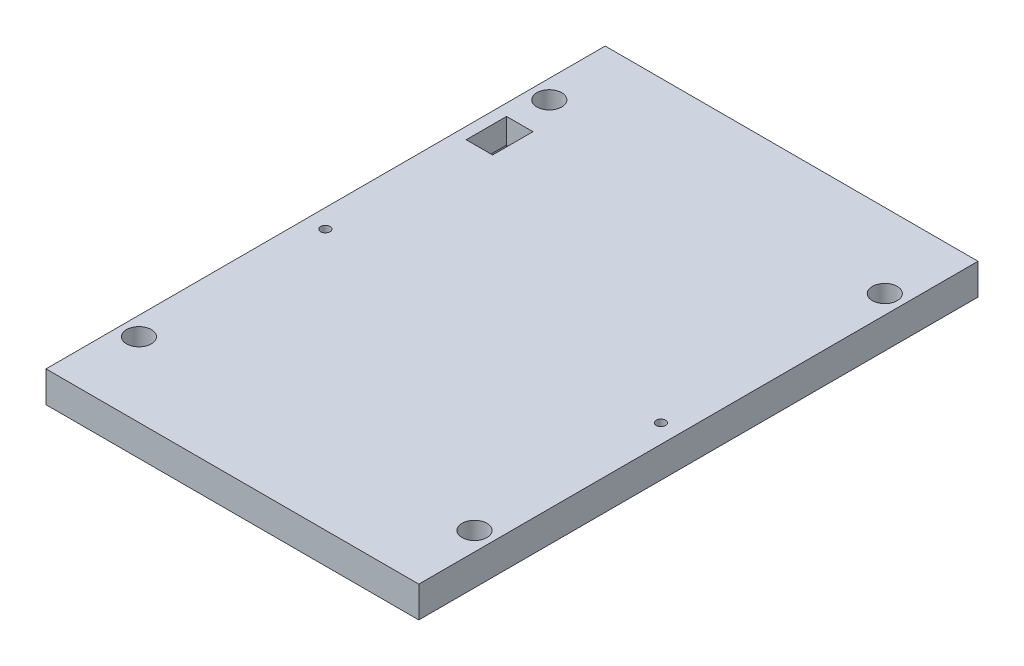
ISO-10303-21;
HEADER;
FILE_DESCRIPTION(('STEP AP214'),'2;1');
FILE_NAME('part.step','',(''),(''),'','','');
FILE_SCHEMA(('AUTOMOTIVE_DESIGN { 1 0 10303 214 1 1 1 1 }'));
ENDSEC;
DATA;
#1=APPLICATION_CONTEXT('core data for automotive mechanical design processes');
#2=APPLICATION_PROTOCOL_DEFINITION('international standard','automotive_design',2000,#1);
#3=PRODUCT_CONTEXT('',#1,'mechanical');
#4=PRODUCT('Part','Part','',(#3));
#5=PRODUCT_RELATED_PRODUCT_CATEGORY('part','',(#4));
#6=PRODUCT_DEFINITION_FORMATION('','',#4);
#7=PRODUCT_DEFINITION_CONTEXT('part definition',#1,'design');
#8=PRODUCT_DEFINITION('design','',#6,#7);
#9=PRODUCT_DEFINITION_SHAPE('','',#8);
#10=(LENGTH_UNIT() NAMED_UNIT(*) SI_UNIT(.MILLI.,.METRE.));
#11=(NAMED_UNIT(*) PLANE_ANGLE_UNIT() SI_UNIT($,.RADIAN.));
#12=(NAMED_UNIT(*) SI_UNIT($,.STERADIAN.) SOLID_ANGLE_UNIT());
#13=UNCERTAINTY_MEASURE_WITH_UNIT(LENGTH_MEASURE(1.E-05),#10,'distance_accuracy_value','');
#14=(GEOMETRIC_REPRESENTATION_CONTEXT(3) GLOBAL_UNCERTAINTY_ASSIGNED_CONTEXT((#13)) GLOBAL_UNIT_ASSIGNED_CONTEXT((#10,
#11,#12)) REPRESENTATION_CONTEXT('',''));
#15=CARTESIAN_POINT('',(0.,0.,0.));
#16=DIRECTION('',(0.,0.,1.));
#17=DIRECTION('',(1.,0.,0.));
#18=AXIS2_PLACEMENT_3D('',#15,#16,#17);
#19=CARTESIAN_POINT('',(-79.5725168398676,10.,74.5725168424847));
#20=DIRECTION('',(1.,0.,0.));
#21=DIRECTION('',(0.,0.,-1.));
#22=AXIS2_PLACEMENT_3D('',#19,#20,#21);
#23=PLANE('',#22);
#24=DIRECTION('',(0.,0.,1.));
#25=VECTOR('',#24,1.);
#26=CARTESIAN_POINT('',(-79.5725168398676,0.,74.5725168424847));
#27=LINE('',#26,#25);
#28=CARTESIAN_POINT('',(-79.5725168398676,0.,-105.427483157515));
#29=VERTEX_POINT('',#28);
#30=CARTESIAN_POINT('',(-79.5725168398676,0.,74.5725168424847));
#31=VERTEX_POINT('',#30);
#32=EDGE_CURVE('E326',#29,#31,#27,.T.);
#33=ORIENTED_EDGE('',*,*,#32,.T.);
#34=DIRECTION('',(0.,-1.,0.));
#35=VECTOR('',#34,1.);
#36=CARTESIAN_POINT('',(-79.5725168398676,10.,74.5725168424847));
#37=LINE('',#36,#35);
#38=CARTESIAN_POINT('',(-79.5725168398676,10.,74.5725168424847));
#39=VERTEX_POINT('',#38);
#40=EDGE_CURVE('E355',#39,#31,#37,.T.);
#41=ORIENTED_EDGE('',*,*,#40,.F.);
#42=DIRECTION('',(0.,0.,1.));
#43=VECTOR('',#42,1.);
#44=CARTESIAN_POINT('',(-79.5725168398676,10.,74.5725168424847));
#45=LINE('',#44,#43);
#46=CARTESIAN_POINT('',(-79.5725168398676,10.,-105.427483157515));
#47=VERTEX_POINT('',#46);
#48=EDGE_CURVE('E329',#47,#39,#45,.T.);
#49=ORIENTED_EDGE('',*,*,#48,.F.);
#50=DIRECTION('',(0.,-1.,0.));
#51=VECTOR('',#50,1.);
#52=CARTESIAN_POINT('',(-79.5725168398676,10.,-105.427483157515));
#53=LINE('',#52,#51);
#54=EDGE_CURVE('E339',#47,#29,#53,.T.);
#55=ORIENTED_EDGE('',*,*,#54,.T.);
#56=EDGE_LOOP('',(#33,#41,#49,#55));
#57=FACE_BOUND('',#56,.T.);
#58=ADVANCED_FACE('F33',(#57),#23,.F.);
#59=CARTESIAN_POINT('',(40.4274831601324,10.,74.5725168424847));
#60=DIRECTION('',(0.,0.,-1.));
#61=DIRECTION('',(-1.,0.,0.));
#62=AXIS2_PLACEMENT_3D('',#59,#60,#61);
#63=PLANE('',#62);
#64=DIRECTION('',(1.,0.,0.));
#65=VECTOR('',#64,1.);
#66=CARTESIAN_POINT('',(40.4274831601324,0.,74.5725168424847));
#67=LINE('',#66,#65);
#68=CARTESIAN_POINT('',(40.4274831601324,0.,74.5725168424847));
#69=VERTEX_POINT('',#68);
#70=EDGE_CURVE('E342',#31,#69,#67,.T.);
#71=ORIENTED_EDGE('',*,*,#70,.T.);
#72=DIRECTION('',(0.,-1.,0.));
#73=VECTOR('',#72,1.);
#74=CARTESIAN_POINT('',(40.4274831601324,10.,74.5725168424847));
#75=LINE('',#74,#73);
#76=CARTESIAN_POINT('',(40.4274831601324,10.,74.5725168424847));
#77=VERTEX_POINT('',#76);
#78=EDGE_CURVE('E352',#77,#69,#75,.T.);
#79=ORIENTED_EDGE('',*,*,#78,.F.);
#80=DIRECTION('',(1.,0.,0.));
#81=VECTOR('',#80,1.);
#82=CARTESIAN_POINT('',(40.4274831601324,10.,74.5725168424847));
#83=LINE('',#82,#81);
#84=EDGE_CURVE('E332',#39,#77,#83,.T.);
#85=ORIENTED_EDGE('',*,*,#84,.F.);
#86=ORIENTED_EDGE('',*,*,#40,.T.);
#87=EDGE_LOOP('',(#71,#79,#85,#86));
#88=FACE_BOUND('',#87,.T.);
#89=ADVANCED_FACE('F378',(#88),#63,.F.);
#90=CARTESIAN_POINT('',(40.4274831601324,10.,74.5725168424847));
#91=DIRECTION('',(-1.,0.,0.));
#92=DIRECTION('',(0.,0.,1.));
#93=AXIS2_PLACEMENT_3D('',#90,#91,#92);
#94=PLANE('',#93);
#95=DIRECTION('',(0.,0.,-1.));
#96=VECTOR('',#95,1.);
#97=CARTESIAN_POINT('',(40.4274831601324,0.,74.5725168424847));
#98=LINE('',#97,#96);
#99=CARTESIAN_POINT('',(40.4274831601324,0.,-105.427483157515));
#100=VERTEX_POINT('',#99);
#101=EDGE_CURVE('E344',#69,#100,#98,.T.);
#102=ORIENTED_EDGE('',*,*,#101,.T.);
#103=DIRECTION('',(0.,-1.,0.));
#104=VECTOR('',#103,1.);
#105=CARTESIAN_POINT('',(40.4274831601324,10.,-105.427483157515));
#106=LINE('',#105,#104);
#107=CARTESIAN_POINT('',(40.4274831601324,10.,-105.427483157515));
#108=VERTEX_POINT('',#107);
#109=EDGE_CURVE('E349',#108,#100,#106,.T.);
#110=ORIENTED_EDGE('',*,*,#109,.F.);
#111=DIRECTION('',(0.,0.,-1.));
#112=VECTOR('',#111,1.);
#113=CARTESIAN_POINT('',(40.4274831601324,10.,74.5725168424847));
#114=LINE('',#113,#112);
#115=EDGE_CURVE('E335',#77,#108,#114,.T.);
#116=ORIENTED_EDGE('',*,*,#115,.F.);
#117=ORIENTED_EDGE('',*,*,#78,.T.);
#118=EDGE_LOOP('',(#102,#110,#116,#117));
#119=FACE_BOUND('',#118,.T.);
#120=ADVANCED_FACE('F383',(#119),#94,.F.);
#121=CARTESIAN_POINT('',(40.4274831601324,10.,-105.427483157515));
#122=DIRECTION('',(0.,0.,1.));
#123=DIRECTION('',(1.,0.,0.));
#124=AXIS2_PLACEMENT_3D('',#121,#122,#123);
#125=PLANE('',#124);
#126=DIRECTION('',(-1.,0.,0.));
#127=VECTOR('',#126,1.);
#128=CARTESIAN_POINT('',(40.4274831601324,0.,-105.427483157515));
#129=LINE('',#128,#127);
#130=EDGE_CURVE('E333',#100,#29,#129,.T.);
#131=ORIENTED_EDGE('',*,*,#130,.T.);
#132=ORIENTED_EDGE('',*,*,#54,.F.);
#133=DIRECTION('',(-1.,0.,0.));
#134=VECTOR('',#133,1.);
#135=CARTESIAN_POINT('',(40.4274831601324,10.,-105.427483157515));
#136=LINE('',#135,#134);
#137=EDGE_CURVE('E337',#108,#47,#136,.T.);
#138=ORIENTED_EDGE('',*,*,#137,.F.);
#139=ORIENTED_EDGE('',*,*,#109,.T.);
#140=EDGE_LOOP('',(#131,#132,#138,#139));
#141=FACE_BOUND('',#140,.T.);
#142=ADVANCED_FACE('F399',(#141),#125,.F.);
#143=CARTESIAN_POINT('',(0.,10.,0.));
#144=DIRECTION('',(0.,1.,0.));
#145=DIRECTION('',(0.,0.,1.));
#146=AXIS2_PLACEMENT_3D('',#143,#144,#145);
#147=PLANE('',#146);
#148=DIRECTION('',(0.,0.,-1.));
#149=VECTOR('',#148,1.);
#150=CARTESIAN_POINT('',(-75.8195072787271,10.,-69.9274831575152));
#151=LINE('',#150,#149);
#152=CARTESIAN_POINT('',(-75.8195072787271,10.,-56.9274831575152));
#153=VERTEX_POINT('',#152);
#154=CARTESIAN_POINT('',(-75.8195072787271,10.,-69.9274831575152));
#155=VERTEX_POINT('',#154);
#156=EDGE_CURVE('E171',#153,#155,#151,.T.);
#157=ORIENTED_EDGE('',*,*,#156,.T.);
#158=DIRECTION('',(1.,0.,0.));
#159=VECTOR('',#158,1.);
#160=CARTESIAN_POINT('',(-67.3195072787271,10.,-69.9274831575152));
#161=LINE('',#160,#159);
#162=CARTESIAN_POINT('',(-67.3195072787271,10.,-69.9274831575152));
#163=VERTEX_POINT('',#162);
#164=EDGE_CURVE('E179',#155,#163,#161,.T.);
#165=ORIENTED_EDGE('',*,*,#164,.T.);
#166=DIRECTION('',(0.,0.,1.));
#167=VECTOR('',#166,1.);
#168=CARTESIAN_POINT('',(-67.3195072787271,10.,-69.9274831575152));
#169=LINE('',#168,#167);
#170=CARTESIAN_POINT('',(-67.3195072787271,10.,-56.9274831575152));
#171=VERTEX_POINT('',#170);
#172=EDGE_CURVE('E47',#163,#171,#169,.T.);
#173=ORIENTED_EDGE('',*,*,#172,.T.);
#174=DIRECTION('',(-1.,0.,0.));
#175=VECTOR('',#174,1.);
#176=CARTESIAN_POINT('',(-67.3195072787271,10.,-56.9274831575152));
#177=LINE('',#176,#175);
#178=EDGE_CURVE('E176',#171,#153,#177,.T.);
#179=ORIENTED_EDGE('',*,*,#178,.T.);
#180=EDGE_LOOP('',(#157,#165,#173,#179));
#181=FACE_BOUND('',#180,.T.);
#182=CARTESIAN_POINT('',(-73.5725168398676,10.,50.6502092702943));
#183=DIRECTION('',(0.,-1.,0.));
#184=DIRECTION('',(0.,0.,-1.));
#185=AXIS2_PLACEMENT_3D('',#182,#183,#184);
#186=CIRCLE('',#185,3.99999999999999);
#187=CARTESIAN_POINT('',(-73.5725168398676,10.,46.6502092702943));
#188=VERTEX_POINT('',#187);
#189=EDGE_CURVE('E299',#188,#188,#186,.T.);
#190=ORIENTED_EDGE('',*,*,#189,.T.);
#191=EDGE_LOOP('',(#190));
#192=FACE_BOUND('',#191,.T.);
#193=CARTESIAN_POINT('',(34.4274831601325,10.,50.6502092702943));
#194=DIRECTION('',(0.,-1.,0.));
#195=DIRECTION('',(0.,0.,-1.));
#196=AXIS2_PLACEMENT_3D('',#193,#194,#195);
#197=CIRCLE('',#196,3.99999999999999);
#198=CARTESIAN_POINT('',(34.4274831601325,10.,46.6502092702943));
#199=VERTEX_POINT('',#198);
#200=EDGE_CURVE('E306',#199,#199,#197,.T.);
#201=ORIENTED_EDGE('',*,*,#200,.T.);
#202=EDGE_LOOP('',(#201));
#203=FACE_BOUND('',#202,.T.);
#204=CARTESIAN_POINT('',(34.4274831601325,10.,-9.34979072970571));
#205=DIRECTION('',(0.,-1.,0.));
#206=DIRECTION('',(0.,0.,-1.));
#207=AXIS2_PLACEMENT_3D('',#204,#205,#206);
#208=CIRCLE('',#207,1.5);
#209=CARTESIAN_POINT('',(34.4274831601325,10.,-10.8497907297057));
#210=VERTEX_POINT('',#209);
#211=EDGE_CURVE('E312',#210,#210,#208,.T.);
#212=ORIENTED_EDGE('',*,*,#211,.T.);
#213=EDGE_LOOP('',(#212));
#214=FACE_BOUND('',#213,.T.);
#215=CARTESIAN_POINT('',(34.4274831601325,10.,-81.4274831575153));
#216=DIRECTION('',(0.,-1.,0.));
#217=DIRECTION('',(0.,0.,-1.));
#218=AXIS2_PLACEMENT_3D('',#215,#216,#217);
#219=CIRCLE('',#218,3.99999999999999);
#220=CARTESIAN_POINT('',(34.4274831601325,10.,-85.4274831575153));
#221=VERTEX_POINT('',#220);
#222=EDGE_CURVE('E318',#221,#221,#219,.T.);
#223=ORIENTED_EDGE('',*,*,#222,.T.);
#224=EDGE_LOOP('',(#223));
#225=FACE_BOUND('',#224,.T.);
#226=CARTESIAN_POINT('',(-73.5725168398676,10.,-81.4274831575151));
#227=DIRECTION('',(0.,-1.,0.));
#228=DIRECTION('',(0.,0.,-1.));
#229=AXIS2_PLACEMENT_3D('',#226,#227,#228);
#230=CIRCLE('',#229,4.00000000000001);
#231=CARTESIAN_POINT('',(-73.5725168398676,10.,-85.4274831575151));
#232=VERTEX_POINT('',#231);
#233=EDGE_CURVE('E293',#232,#232,#230,.T.);
#234=ORIENTED_EDGE('',*,*,#233,.T.);
#235=EDGE_LOOP('',(#234));
#236=FACE_BOUND('',#235,.T.);
#237=CARTESIAN_POINT('',(-73.5725168398676,10.,-9.34979072970571));
#238=DIRECTION('',(0.,-1.,0.));
#239=DIRECTION('',(0.,0.,-1.));
#240=AXIS2_PLACEMENT_3D('',#237,#238,#239);
#241=CIRCLE('',#240,1.5);
#242=CARTESIAN_POINT('',(-73.5725168398676,10.,-10.8497907297057));
#243=VERTEX_POINT('',#242);
#244=EDGE_CURVE('E323',#243,#243,#241,.T.);
#245=ORIENTED_EDGE('',*,*,#244,.T.);
#246=EDGE_LOOP('',(#245));
#247=FACE_BOUND('',#246,.T.);
#248=ORIENTED_EDGE('',*,*,#48,.T.);
#249=ORIENTED_EDGE('',*,*,#84,.T.);
#250=ORIENTED_EDGE('',*,*,#115,.T.);
#251=ORIENTED_EDGE('',*,*,#137,.T.);
#252=EDGE_LOOP('',(#248,#249,#250,#251));
#253=FACE_BOUND('',#252,.T.);
#254=ADVANCED_FACE('F183',(#181,#192,#203,#214,#225,#236,#247,#253),#147,.T.);
#255=CARTESIAN_POINT('',(0.,0.,0.));
#256=DIRECTION('',(0.,1.,0.));
#257=DIRECTION('',(0.,0.,1.));
#258=AXIS2_PLACEMENT_3D('',#255,#256,#257);
#259=PLANE('',#258);
#260=DIRECTION('',(1.,0.,0.));
#261=VECTOR('',#260,1.);
#262=CARTESIAN_POINT('',(13.3217414866803,0.,18.0763742513696));
#263=LINE('',#262,#261);
#264=CARTESIAN_POINT('',(-53.6782585133198,0.,18.0763742513696));
#265=VERTEX_POINT('',#264);
#266=CARTESIAN_POINT('',(13.3217414866803,0.,18.0763742513696));
#267=VERTEX_POINT('',#266);
#268=EDGE_CURVE('E213',#265,#267,#263,.T.);
#269=ORIENTED_EDGE('',*,*,#268,.F.);
#270=DIRECTION('',(0.,0.,-1.));
#271=VECTOR('',#270,1.);
#272=CARTESIAN_POINT('',(-53.6782585133198,0.,18.0763742513696));
#273=LINE('',#272,#271);
#274=CARTESIAN_POINT('',(-53.6782585133198,0.,72.0763742513695));
#275=VERTEX_POINT('',#274);
#276=EDGE_CURVE('E211',#275,#265,#273,.T.);
#277=ORIENTED_EDGE('',*,*,#276,.F.);
#278=DIRECTION('',(-1.,0.,0.));
#279=VECTOR('',#278,1.);
#280=CARTESIAN_POINT('',(13.3217414866803,0.,72.0763742513696));
#281=LINE('',#280,#279);
#282=CARTESIAN_POINT('',(13.3217414866803,0.,72.0763742513696));
#283=VERTEX_POINT('',#282);
#284=EDGE_CURVE('E201',#283,#275,#281,.T.);
#285=ORIENTED_EDGE('',*,*,#284,.F.);
#286=DIRECTION('',(0.,0.,1.));
#287=VECTOR('',#286,1.);
#288=CARTESIAN_POINT('',(13.3217414866803,0.,18.0763742513696));
#289=LINE('',#288,#287);
#290=EDGE_CURVE('E217',#267,#283,#289,.T.);
#291=ORIENTED_EDGE('',*,*,#290,.F.);
#292=EDGE_LOOP('',(#269,#277,#285,#291));
#293=FACE_BOUND('',#292,.T.);
#294=DIRECTION('',(1.,0.,0.));
#295=VECTOR('',#294,1.);
#296=CARTESIAN_POINT('',(27.8739263182685,0.,-96.828520247566));
#297=LINE('',#296,#295);
#298=CARTESIAN_POINT('',(-57.1260736817315,0.,-96.828520247566));
#299=VERTEX_POINT('',#298);
#300=CARTESIAN_POINT('',(27.8739263182685,0.,-96.828520247566));
#301=VERTEX_POINT('',#300);
#302=EDGE_CURVE('E247',#299,#301,#297,.T.);
#303=ORIENTED_EDGE('',*,*,#302,.F.);
#304=DIRECTION('',(0.,0.,-1.));
#305=VECTOR('',#304,1.);
#306=CARTESIAN_POINT('',(-57.1260736817315,0.,-96.828520247566));
#307=LINE('',#306,#305);
#308=CARTESIAN_POINT('',(-57.1260736817315,0.,-55.8285202475661));
#309=VERTEX_POINT('',#308);
#310=EDGE_CURVE('E245',#309,#299,#307,.T.);
#311=ORIENTED_EDGE('',*,*,#310,.F.);
#312=DIRECTION('',(-1.,0.,0.));
#313=VECTOR('',#312,1.);
#314=CARTESIAN_POINT('',(27.8739263182685,0.,-55.828520247566));
#315=LINE('',#314,#313);
#316=CARTESIAN_POINT('',(27.8739263182685,0.,-55.828520247566));
#317=VERTEX_POINT('',#316);
#318=EDGE_CURVE('E235',#317,#309,#315,.T.);
#319=ORIENTED_EDGE('',*,*,#318,.F.);
#320=DIRECTION('',(0.,0.,1.));
#321=VECTOR('',#320,1.);
#322=CARTESIAN_POINT('',(27.8739263182685,0.,-96.828520247566));
#323=LINE('',#322,#321);
#324=EDGE_CURVE('E251',#301,#317,#323,.T.);
#325=ORIENTED_EDGE('',*,*,#324,.F.);
#326=EDGE_LOOP('',(#303,#311,#319,#325));
#327=FACE_BOUND('',#326,.T.);
#328=DIRECTION('',(-1.,0.,0.));
#329=VECTOR('',#328,1.);
#330=CARTESIAN_POINT('',(-76.7495072787272,0.,-56.0774831575152));
#331=LINE('',#330,#329);
#332=CARTESIAN_POINT('',(-66.3895072787272,0.,-56.0774831575152));
#333=VERTEX_POINT('',#332);
#334=CARTESIAN_POINT('',(-76.7495072787272,0.,-56.0774831575152));
#335=VERTEX_POINT('',#334);
#336=EDGE_CURVE('E278',#333,#335,#331,.T.);
#337=ORIENTED_EDGE('',*,*,#336,.F.);
#338=DIRECTION('',(0.,0.,1.));
#339=VECTOR('',#338,1.);
#340=CARTESIAN_POINT('',(-66.3895072787272,0.,-56.0774831575152));
#341=LINE('',#340,#339);
#342=CARTESIAN_POINT('',(-66.3895072787272,0.,-70.7774831575152));
#343=VERTEX_POINT('',#342);
#344=EDGE_CURVE('E192',#343,#333,#341,.T.);
#345=ORIENTED_EDGE('',*,*,#344,.F.);
#346=DIRECTION('',(1.,0.,0.));
#347=VECTOR('',#346,1.);
#348=CARTESIAN_POINT('',(-76.7495072787272,0.,-70.7774831575152));
#349=LINE('',#348,#347);
#350=CARTESIAN_POINT('',(-76.7495072787272,0.,-70.7774831575152));
#351=VERTEX_POINT('',#350);
#352=EDGE_CURVE('E267',#351,#343,#349,.T.);
#353=ORIENTED_EDGE('',*,*,#352,.F.);
#354=DIRECTION('',(0.,0.,-1.));
#355=VECTOR('',#354,1.);
#356=CARTESIAN_POINT('',(-76.7495072787272,0.,-56.0774831575152));
#357=LINE('',#356,#355);
#358=EDGE_CURVE('E281',#335,#351,#357,.T.);
#359=ORIENTED_EDGE('',*,*,#358,.F.);
#360=EDGE_LOOP('',(#337,#345,#353,#359));
#361=FACE_BOUND('',#360,.T.);
#362=CARTESIAN_POINT('',(-73.5725168398676,0.,50.6502092702943));
#363=DIRECTION('',(0.,-1.,0.));
#364=DIRECTION('',(0.,0.,-1.));
#365=AXIS2_PLACEMENT_3D('',#362,#363,#364);
#366=CIRCLE('',#365,3.99999999999999);
#367=CARTESIAN_POINT('',(-73.5725168398676,0.,46.6502092702943));
#368=VERTEX_POINT('',#367);
#369=EDGE_CURVE('E303',#368,#368,#366,.T.);
#370=ORIENTED_EDGE('',*,*,#369,.F.);
#371=EDGE_LOOP('',(#370));
#372=FACE_BOUND('',#371,.T.);
#373=CARTESIAN_POINT('',(34.4274831601325,0.,50.6502092702943));
#374=DIRECTION('',(0.,-1.,0.));
#375=DIRECTION('',(0.,0.,-1.));
#376=AXIS2_PLACEMENT_3D('',#373,#374,#375);
#377=CIRCLE('',#376,3.99999999999999);
#378=CARTESIAN_POINT('',(34.4274831601325,0.,46.6502092702943));
#379=VERTEX_POINT('',#378);
#380=EDGE_CURVE('E309',#379,#379,#377,.T.);
#381=ORIENTED_EDGE('',*,*,#380,.F.);
#382=EDGE_LOOP('',(#381));
#383=FACE_BOUND('',#382,.T.);
#384=CARTESIAN_POINT('',(34.4274831601325,0.,-9.34979072970571));
#385=DIRECTION('',(0.,-1.,0.));
#386=DIRECTION('',(0.,0.,-1.));
#387=AXIS2_PLACEMENT_3D('',#384,#385,#386);
#388=CIRCLE('',#387,1.5);
#389=CARTESIAN_POINT('',(34.4274831601325,0.,-10.8497907297057));
#390=VERTEX_POINT('',#389);
#391=EDGE_CURVE('E315',#390,#390,#388,.T.);
#392=ORIENTED_EDGE('',*,*,#391,.F.);
#393=EDGE_LOOP('',(#392));
#394=FACE_BOUND('',#393,.T.);
#395=CARTESIAN_POINT('',(34.4274831601325,0.,-81.4274831575153));
#396=DIRECTION('',(0.,-1.,0.));
#397=DIRECTION('',(0.,0.,-1.));
#398=AXIS2_PLACEMENT_3D('',#395,#396,#397);
#399=CIRCLE('',#398,3.99999999999999);
#400=CARTESIAN_POINT('',(34.4274831601325,0.,-85.4274831575153));
#401=VERTEX_POINT('',#400);
#402=EDGE_CURVE('E296',#401,#401,#399,.T.);
#403=ORIENTED_EDGE('',*,*,#402,.F.);
#404=EDGE_LOOP('',(#403));
#405=FACE_BOUND('',#404,.T.);
#406=CARTESIAN_POINT('',(-73.5725168398676,0.,-81.4274831575151));
#407=DIRECTION('',(0.,-1.,0.));
#408=DIRECTION('',(0.,0.,-1.));
#409=AXIS2_PLACEMENT_3D('',#406,#407,#408);
#410=CIRCLE('',#409,4.00000000000001);
#411=CARTESIAN_POINT('',(-73.5725168398676,0.,-85.4274831575151));
#412=VERTEX_POINT('',#411);
#413=EDGE_CURVE('E224',#412,#412,#410,.T.);
#414=ORIENTED_EDGE('',*,*,#413,.F.);
#415=EDGE_LOOP('',(#414));
#416=FACE_BOUND('',#415,.T.);
#417=CARTESIAN_POINT('',(-73.5725168398676,0.,-9.34979072970571));
#418=DIRECTION('',(0.,-1.,0.));
#419=DIRECTION('',(0.,0.,-1.));
#420=AXIS2_PLACEMENT_3D('',#417,#418,#419);
#421=CIRCLE('',#420,1.5);
#422=CARTESIAN_POINT('',(-73.5725168398676,0.,-10.8497907297057));
#423=VERTEX_POINT('',#422);
#424=EDGE_CURVE('E302',#423,#423,#421,.T.);
#425=ORIENTED_EDGE('',*,*,#424,.F.);
#426=EDGE_LOOP('',(#425));
#427=FACE_BOUND('',#426,.T.);
#428=ORIENTED_EDGE('',*,*,#32,.F.);
#429=ORIENTED_EDGE('',*,*,#130,.F.);
#430=ORIENTED_EDGE('',*,*,#101,.F.);
#431=ORIENTED_EDGE('',*,*,#70,.F.);
#432=EDGE_LOOP('',(#428,#429,#430,#431));
#433=FACE_BOUND('',#432,.T.);
#434=ADVANCED_FACE('F391',(#293,#327,#361,#372,#383,#394,#405,#416,#427,#433),#259,.F.);
#435=CARTESIAN_POINT('',(-73.5725168398676,10.,-9.34979072970571));
#436=DIRECTION('',(0.,-1.,0.));
#437=DIRECTION('',(0.,0.,-1.));
#438=AXIS2_PLACEMENT_3D('',#435,#436,#437);
#439=CYLINDRICAL_SURFACE('',#438,1.5);
#440=ORIENTED_EDGE('',*,*,#244,.F.);
#441=EDGE_LOOP('',(#440));
#442=FACE_BOUND('',#441,.T.);
#443=ORIENTED_EDGE('',*,*,#424,.T.);
#444=EDGE_LOOP('',(#443));
#445=FACE_BOUND('',#444,.T.);
#446=ADVANCED_FACE('F410',(#442,#445),#439,.F.);
#447=CARTESIAN_POINT('',(-73.5725168398676,10.,-81.4274831575151));
#448=DIRECTION('',(0.,-1.,0.));
#449=DIRECTION('',(0.,0.,-1.));
#450=AXIS2_PLACEMENT_3D('',#447,#448,#449);
#451=CYLINDRICAL_SURFACE('',#450,4.00000000000001);
#452=ORIENTED_EDGE('',*,*,#233,.F.);
#453=EDGE_LOOP('',(#452));
#454=FACE_BOUND('',#453,.T.);
#455=ORIENTED_EDGE('',*,*,#413,.T.);
#456=EDGE_LOOP('',(#455));
#457=FACE_BOUND('',#456,.T.);
#458=ADVANCED_FACE('F416',(#454,#457),#451,.F.);
#459=CARTESIAN_POINT('',(34.4274831601325,10.,-81.4274831575153));
#460=DIRECTION('',(0.,-1.,0.));
#461=DIRECTION('',(0.,0.,-1.));
#462=AXIS2_PLACEMENT_3D('',#459,#460,#461);
#463=CYLINDRICAL_SURFACE('',#462,3.99999999999999);
#464=ORIENTED_EDGE('',*,*,#222,.F.);
#465=EDGE_LOOP('',(#464));
#466=FACE_BOUND('',#465,.T.);
#467=ORIENTED_EDGE('',*,*,#402,.T.);
#468=EDGE_LOOP('',(#467));
#469=FACE_BOUND('',#468,.T.);
#470=ADVANCED_FACE('F418',(#466,#469),#463,.F.);
#471=CARTESIAN_POINT('',(34.4274831601325,10.,-9.34979072970571));
#472=DIRECTION('',(0.,-1.,0.));
#473=DIRECTION('',(0.,0.,-1.));
#474=AXIS2_PLACEMENT_3D('',#471,#472,#473);
#475=CYLINDRICAL_SURFACE('',#474,1.5);
#476=ORIENTED_EDGE('',*,*,#211,.F.);
#477=EDGE_LOOP('',(#476));
#478=FACE_BOUND('',#477,.T.);
#479=ORIENTED_EDGE('',*,*,#391,.T.);
#480=EDGE_LOOP('',(#479));
#481=FACE_BOUND('',#480,.T.);
#482=ADVANCED_FACE('F421',(#478,#481),#475,.F.);
#483=CARTESIAN_POINT('',(34.4274831601325,10.,50.6502092702943));
#484=DIRECTION('',(0.,-1.,0.));
#485=DIRECTION('',(0.,0.,-1.));
#486=AXIS2_PLACEMENT_3D('',#483,#484,#485);
#487=CYLINDRICAL_SURFACE('',#486,3.99999999999999);
#488=ORIENTED_EDGE('',*,*,#200,.F.);
#489=EDGE_LOOP('',(#488));
#490=FACE_BOUND('',#489,.T.);
#491=ORIENTED_EDGE('',*,*,#380,.T.);
#492=EDGE_LOOP('',(#491));
#493=FACE_BOUND('',#492,.T.);
#494=ADVANCED_FACE('F425',(#490,#493),#487,.F.);
#495=CARTESIAN_POINT('',(-73.5725168398676,10.,50.6502092702943));
#496=DIRECTION('',(0.,-1.,0.));
#497=DIRECTION('',(0.,0.,-1.));
#498=AXIS2_PLACEMENT_3D('',#495,#496,#497);
#499=CYLINDRICAL_SURFACE('',#498,3.99999999999999);
#500=ORIENTED_EDGE('',*,*,#189,.F.);
#501=EDGE_LOOP('',(#500));
#502=FACE_BOUND('',#501,.T.);
#503=ORIENTED_EDGE('',*,*,#369,.T.);
#504=EDGE_LOOP('',(#503));
#505=FACE_BOUND('',#504,.T.);
#506=ADVANCED_FACE('F429',(#502,#505),#499,.F.);
#507=CARTESIAN_POINT('',(-66.3895072787272,2.,-56.0774831575152));
#508=DIRECTION('',(1.,0.,0.));
#509=DIRECTION('',(0.,0.,-1.));
#510=AXIS2_PLACEMENT_3D('',#507,#508,#509);
#511=PLANE('',#510);
#512=ORIENTED_EDGE('',*,*,#344,.T.);
#513=DIRECTION('',(0.,-1.,0.));
#514=VECTOR('',#513,1.);
#515=CARTESIAN_POINT('',(-66.3895072787272,2.,-56.0774831575152));
#516=LINE('',#515,#514);
#517=CARTESIAN_POINT('',(-66.3895072787272,2.,-56.0774831575152));
#518=VERTEX_POINT('',#517);
#519=EDGE_CURVE('E276',#518,#333,#516,.T.);
#520=ORIENTED_EDGE('',*,*,#519,.F.);
#521=DIRECTION('',(0.,0.,1.));
#522=VECTOR('',#521,1.);
#523=CARTESIAN_POINT('',(-66.3895072787272,2.,-56.0774831575152));
#524=LINE('',#523,#522);
#525=CARTESIAN_POINT('',(-66.3895072787272,2.,-70.7774831575152));
#526=VERTEX_POINT('',#525);
#527=EDGE_CURVE('E263',#526,#518,#524,.T.);
#528=ORIENTED_EDGE('',*,*,#527,.F.);
#529=DIRECTION('',(0.,-1.,0.));
#530=VECTOR('',#529,1.);
#531=CARTESIAN_POINT('',(-66.3895072787272,2.,-70.7774831575152));
#532=LINE('',#531,#530);
#533=EDGE_CURVE('E248',#526,#343,#532,.T.);
#534=ORIENTED_EDGE('',*,*,#533,.T.);
#535=EDGE_LOOP('',(#512,#520,#528,#534));
#536=FACE_BOUND('',#535,.T.);
#537=ADVANCED_FACE('F433',(#536),#511,.F.);
#538=CARTESIAN_POINT('',(-76.7495072787272,2.,-70.7774831575152));
#539=DIRECTION('',(0.,0.,-1.));
#540=DIRECTION('',(-1.,0.,0.));
#541=AXIS2_PLACEMENT_3D('',#538,#539,#540);
#542=PLANE('',#541);
#543=ORIENTED_EDGE('',*,*,#352,.T.);
#544=ORIENTED_EDGE('',*,*,#533,.F.);
#545=DIRECTION('',(1.,0.,0.));
#546=VECTOR('',#545,1.);
#547=CARTESIAN_POINT('',(-76.7495072787272,2.,-70.7774831575152));
#548=LINE('',#547,#546);
#549=CARTESIAN_POINT('',(-76.7495072787272,2.,-70.7774831575152));
#550=VERTEX_POINT('',#549);
#551=EDGE_CURVE('E273',#550,#526,#548,.T.);
#552=ORIENTED_EDGE('',*,*,#551,.F.);
#553=DIRECTION('',(0.,-1.,0.));
#554=VECTOR('',#553,1.);
#555=CARTESIAN_POINT('',(-76.7495072787272,2.,-70.7774831575152));
#556=LINE('',#555,#554);
#557=EDGE_CURVE('E287',#550,#351,#556,.T.);
#558=ORIENTED_EDGE('',*,*,#557,.T.);
#559=EDGE_LOOP('',(#543,#544,#552,#558));
#560=FACE_BOUND('',#559,.T.);
#561=ADVANCED_FACE('F440',(#560),#542,.F.);
#562=CARTESIAN_POINT('',(-76.7495072787272,2.,-56.0774831575152));
#563=DIRECTION('',(-1.,0.,0.));
#564=DIRECTION('',(0.,0.,1.));
#565=AXIS2_PLACEMENT_3D('',#562,#563,#564);
#566=PLANE('',#565);
#567=ORIENTED_EDGE('',*,*,#358,.T.);
#568=ORIENTED_EDGE('',*,*,#557,.F.);
#569=DIRECTION('',(0.,0.,-1.));
#570=VECTOR('',#569,1.);
#571=CARTESIAN_POINT('',(-76.7495072787272,2.,-56.0774831575152));
#572=LINE('',#571,#570);
#573=CARTESIAN_POINT('',(-76.7495072787272,2.,-56.0774831575152));
#574=VERTEX_POINT('',#573);
#575=EDGE_CURVE('E270',#574,#550,#572,.T.);
#576=ORIENTED_EDGE('',*,*,#575,.F.);
#577=DIRECTION('',(0.,-1.,0.));
#578=VECTOR('',#577,1.);
#579=CARTESIAN_POINT('',(-76.7495072787272,2.,-56.0774831575152));
#580=LINE('',#579,#578);
#581=EDGE_CURVE('E289',#574,#335,#580,.T.);
#582=ORIENTED_EDGE('',*,*,#581,.T.);
#583=EDGE_LOOP('',(#567,#568,#576,#582));
#584=FACE_BOUND('',#583,.T.);
#585=ADVANCED_FACE('F445',(#584),#566,.F.);
#586=CARTESIAN_POINT('',(-76.7495072787272,2.,-56.0774831575152));
#587=DIRECTION('',(0.,0.,1.));
#588=DIRECTION('',(1.,0.,0.));
#589=AXIS2_PLACEMENT_3D('',#586,#587,#588);
#590=PLANE('',#589);
#591=ORIENTED_EDGE('',*,*,#336,.T.);
#592=ORIENTED_EDGE('',*,*,#581,.F.);
#593=DIRECTION('',(-1.,0.,0.));
#594=VECTOR('',#593,1.);
#595=CARTESIAN_POINT('',(-76.7495072787272,2.,-56.0774831575152));
#596=LINE('',#595,#594);
#597=EDGE_CURVE('E266',#518,#574,#596,.T.);
#598=ORIENTED_EDGE('',*,*,#597,.F.);
#599=ORIENTED_EDGE('',*,*,#519,.T.);
#600=EDGE_LOOP('',(#591,#592,#598,#599));
#601=FACE_BOUND('',#600,.T.);
#602=ADVANCED_FACE('F442',(#601),#590,.F.);
#603=CARTESIAN_POINT('',(0.,2.,0.));
#604=DIRECTION('',(0.,-1.,0.));
#605=DIRECTION('',(0.,0.,-1.));
#606=AXIS2_PLACEMENT_3D('',#603,#604,#605);
#607=PLANE('',#606);
#608=DIRECTION('',(0.,0.,-1.));
#609=VECTOR('',#608,1.);
#610=CARTESIAN_POINT('',(-75.8195072787271,2.,0.));
#611=LINE('',#610,#609);
#612=CARTESIAN_POINT('',(-75.8195072787271,2.,-56.9274831575152));
#613=VERTEX_POINT('',#612);
#614=CARTESIAN_POINT('',(-75.8195072787271,2.,-69.9274831575152));
#615=VERTEX_POINT('',#614);
#616=EDGE_CURVE('E11',#613,#615,#611,.T.);
#617=ORIENTED_EDGE('',*,*,#616,.F.);
#618=DIRECTION('',(-1.,0.,0.));
#619=VECTOR('',#618,1.);
#620=CARTESIAN_POINT('',(0.,2.,-56.9274831575152));
#621=LINE('',#620,#619);
#622=CARTESIAN_POINT('',(-67.3195072787271,2.,-56.9274831575152));
#623=VERTEX_POINT('',#622);
#624=EDGE_CURVE('E40',#623,#613,#621,.T.);
#625=ORIENTED_EDGE('',*,*,#624,.F.);
#626=DIRECTION('',(0.,0.,1.));
#627=VECTOR('',#626,1.);
#628=CARTESIAN_POINT('',(-67.3195072787271,2.,0.));
#629=LINE('',#628,#627);
#630=CARTESIAN_POINT('',(-67.3195072787271,2.,-69.9274831575152));
#631=VERTEX_POINT('',#630);
#632=EDGE_CURVE('E360',#631,#623,#629,.T.);
#633=ORIENTED_EDGE('',*,*,#632,.F.);
#634=DIRECTION('',(1.,0.,0.));
#635=VECTOR('',#634,1.);
#636=CARTESIAN_POINT('',(0.,2.,-69.9274831575152));
#637=LINE('',#636,#635);
#638=EDGE_CURVE('E358',#615,#631,#637,.T.);
#639=ORIENTED_EDGE('',*,*,#638,.F.);
#640=EDGE_LOOP('',(#617,#625,#633,#639));
#641=FACE_BOUND('',#640,.T.);
#642=ORIENTED_EDGE('',*,*,#527,.T.);
#643=ORIENTED_EDGE('',*,*,#597,.T.);
#644=ORIENTED_EDGE('',*,*,#575,.T.);
#645=ORIENTED_EDGE('',*,*,#551,.T.);
#646=EDGE_LOOP('',(#642,#643,#644,#645));
#647=FACE_BOUND('',#646,.T.);
#648=ADVANCED_FACE('F366',(#641,#647),#607,.T.);
#649=CARTESIAN_POINT('',(-57.1260736817315,2.,-96.828520247566));
#650=DIRECTION('',(-1.,0.,0.));
#651=DIRECTION('',(0.,0.,1.));
#652=AXIS2_PLACEMENT_3D('',#649,#650,#651);
#653=PLANE('',#652);
#654=ORIENTED_EDGE('',*,*,#310,.T.);
#655=DIRECTION('',(0.,-1.,0.));
#656=VECTOR('',#655,1.);
#657=CARTESIAN_POINT('',(-57.1260736817315,2.,-96.828520247566));
#658=LINE('',#657,#656);
#659=CARTESIAN_POINT('',(-57.1260736817315,2.,-96.828520247566));
#660=VERTEX_POINT('',#659);
#661=EDGE_CURVE('E244',#660,#299,#658,.T.);
#662=ORIENTED_EDGE('',*,*,#661,.F.);
#663=DIRECTION('',(0.,0.,-1.));
#664=VECTOR('',#663,1.);
#665=CARTESIAN_POINT('',(-57.1260736817315,2.,-96.828520247566));
#666=LINE('',#665,#664);
#667=CARTESIAN_POINT('',(-57.1260736817315,2.,-55.8285202475661));
#668=VERTEX_POINT('',#667);
#669=EDGE_CURVE('E231',#668,#660,#666,.T.);
#670=ORIENTED_EDGE('',*,*,#669,.F.);
#671=DIRECTION('',(0.,-1.,0.));
#672=VECTOR('',#671,1.);
#673=CARTESIAN_POINT('',(-57.1260736817315,2.,-55.8285202475661));
#674=LINE('',#673,#672);
#675=EDGE_CURVE('E214',#668,#309,#674,.T.);
#676=ORIENTED_EDGE('',*,*,#675,.T.);
#677=EDGE_LOOP('',(#654,#662,#670,#676));
#678=FACE_BOUND('',#677,.T.);
#679=ADVANCED_FACE('F455',(#678),#653,.F.);
#680=CARTESIAN_POINT('',(27.8739263182685,2.,-55.828520247566));
#681=DIRECTION('',(0.,0.,1.));
#682=DIRECTION('',(1.,0.,0.));
#683=AXIS2_PLACEMENT_3D('',#680,#681,#682);
#684=PLANE('',#683);
#685=ORIENTED_EDGE('',*,*,#318,.T.);
#686=ORIENTED_EDGE('',*,*,#675,.F.);
#687=DIRECTION('',(-1.,0.,0.));
#688=VECTOR('',#687,1.);
#689=CARTESIAN_POINT('',(27.8739263182685,2.,-55.828520247566));
#690=LINE('',#689,#688);
#691=CARTESIAN_POINT('',(27.8739263182685,2.,-55.828520247566));
#692=VERTEX_POINT('',#691);
#693=EDGE_CURVE('E241',#692,#668,#690,.T.);
#694=ORIENTED_EDGE('',*,*,#693,.F.);
#695=DIRECTION('',(0.,-1.,0.));
#696=VECTOR('',#695,1.);
#697=CARTESIAN_POINT('',(27.8739263182685,2.,-55.828520247566));
#698=LINE('',#697,#696);
#699=EDGE_CURVE('E257',#692,#317,#698,.T.);
#700=ORIENTED_EDGE('',*,*,#699,.T.);
#701=EDGE_LOOP('',(#685,#686,#694,#700));
#702=FACE_BOUND('',#701,.T.);
#703=ADVANCED_FACE('F458',(#702),#684,.F.);
#704=CARTESIAN_POINT('',(27.8739263182685,2.,-96.828520247566));
#705=DIRECTION('',(1.,0.,0.));
#706=DIRECTION('',(0.,0.,-1.));
#707=AXIS2_PLACEMENT_3D('',#704,#705,#706);
#708=PLANE('',#707);
#709=ORIENTED_EDGE('',*,*,#324,.T.);
#710=ORIENTED_EDGE('',*,*,#699,.F.);
#711=DIRECTION('',(0.,0.,1.));
#712=VECTOR('',#711,1.);
#713=CARTESIAN_POINT('',(27.8739263182685,2.,-96.828520247566));
#714=LINE('',#713,#712);
#715=CARTESIAN_POINT('',(27.8739263182685,2.,-96.828520247566));
#716=VERTEX_POINT('',#715);
#717=EDGE_CURVE('E238',#716,#692,#714,.T.);
#718=ORIENTED_EDGE('',*,*,#717,.F.);
#719=DIRECTION('',(0.,-1.,0.));
#720=VECTOR('',#719,1.);
#721=CARTESIAN_POINT('',(27.8739263182685,2.,-96.828520247566));
#722=LINE('',#721,#720);
#723=EDGE_CURVE('E259',#716,#301,#722,.T.);
#724=ORIENTED_EDGE('',*,*,#723,.T.);
#725=EDGE_LOOP('',(#709,#710,#718,#724));
#726=FACE_BOUND('',#725,.T.);
#727=ADVANCED_FACE('F464',(#726),#708,.F.);
#728=CARTESIAN_POINT('',(27.8739263182685,2.,-96.828520247566));
#729=DIRECTION('',(0.,0.,-1.));
#730=DIRECTION('',(-1.,0.,0.));
#731=AXIS2_PLACEMENT_3D('',#728,#729,#730);
#732=PLANE('',#731);
#733=ORIENTED_EDGE('',*,*,#302,.T.);
#734=ORIENTED_EDGE('',*,*,#723,.F.);
#735=DIRECTION('',(1.,0.,0.));
#736=VECTOR('',#735,1.);
#737=CARTESIAN_POINT('',(27.8739263182685,2.,-96.828520247566));
#738=LINE('',#737,#736);
#739=EDGE_CURVE('E234',#660,#716,#738,.T.);
#740=ORIENTED_EDGE('',*,*,#739,.F.);
#741=ORIENTED_EDGE('',*,*,#661,.T.);
#742=EDGE_LOOP('',(#733,#734,#740,#741));
#743=FACE_BOUND('',#742,.T.);
#744=ADVANCED_FACE('F460',(#743),#732,.F.);
#745=CARTESIAN_POINT('',(0.,2.,0.));
#746=DIRECTION('',(0.,-1.,0.));
#747=DIRECTION('',(0.,0.,-1.));
#748=AXIS2_PLACEMENT_3D('',#745,#746,#747);
#749=PLANE('',#748);
#750=ORIENTED_EDGE('',*,*,#669,.T.);
#751=ORIENTED_EDGE('',*,*,#739,.T.);
#752=ORIENTED_EDGE('',*,*,#717,.T.);
#753=ORIENTED_EDGE('',*,*,#693,.T.);
#754=EDGE_LOOP('',(#750,#751,#752,#753));
#755=FACE_BOUND('',#754,.T.);
#756=ADVANCED_FACE('F463',(#755),#749,.T.);
#757=CARTESIAN_POINT('',(-53.6782585133198,2.,18.0763742513696));
#758=DIRECTION('',(-1.,0.,0.));
#759=DIRECTION('',(0.,0.,1.));
#760=AXIS2_PLACEMENT_3D('',#757,#758,#759);
#761=PLANE('',#760);
#762=ORIENTED_EDGE('',*,*,#276,.T.);
#763=DIRECTION('',(0.,-1.,0.));
#764=VECTOR('',#763,1.);
#765=CARTESIAN_POINT('',(-53.6782585133198,2.,18.0763742513696));
#766=LINE('',#765,#764);
#767=CARTESIAN_POINT('',(-53.6782585133198,2.,18.0763742513696));
#768=VERTEX_POINT('',#767);
#769=EDGE_CURVE('E210',#768,#265,#766,.T.);
#770=ORIENTED_EDGE('',*,*,#769,.F.);
#771=DIRECTION('',(0.,0.,-1.));
#772=VECTOR('',#771,1.);
#773=CARTESIAN_POINT('',(-53.6782585133198,2.,18.0763742513696));
#774=LINE('',#773,#772);
#775=CARTESIAN_POINT('',(-53.6782585133198,2.,72.0763742513695));
#776=VERTEX_POINT('',#775);
#777=EDGE_CURVE('E197',#776,#768,#774,.T.);
#778=ORIENTED_EDGE('',*,*,#777,.F.);
#779=DIRECTION('',(0.,-1.,0.));
#780=VECTOR('',#779,1.);
#781=CARTESIAN_POINT('',(-53.6782585133198,2.,72.0763742513695));
#782=LINE('',#781,#780);
#783=EDGE_CURVE('E222',#776,#275,#782,.T.);
#784=ORIENTED_EDGE('',*,*,#783,.T.);
#785=EDGE_LOOP('',(#762,#770,#778,#784));
#786=FACE_BOUND('',#785,.T.);
#787=ADVANCED_FACE('F474',(#786),#761,.F.);
#788=CARTESIAN_POINT('',(13.3217414866803,2.,72.0763742513696));
#789=DIRECTION('',(0.,0.,1.));
#790=DIRECTION('',(1.,0.,0.));
#791=AXIS2_PLACEMENT_3D('',#788,#789,#790);
#792=PLANE('',#791);
#793=ORIENTED_EDGE('',*,*,#284,.T.);
#794=ORIENTED_EDGE('',*,*,#783,.F.);
#795=DIRECTION('',(-1.,0.,0.));
#796=VECTOR('',#795,1.);
#797=CARTESIAN_POINT('',(13.3217414866803,2.,72.0763742513696));
#798=LINE('',#797,#796);
#799=CARTESIAN_POINT('',(13.3217414866803,2.,72.0763742513696));
#800=VERTEX_POINT('',#799);
#801=EDGE_CURVE('E207',#800,#776,#798,.T.);
#802=ORIENTED_EDGE('',*,*,#801,.F.);
#803=DIRECTION('',(0.,-1.,0.));
#804=VECTOR('',#803,1.);
#805=CARTESIAN_POINT('',(13.3217414866803,2.,72.0763742513696));
#806=LINE('',#805,#804);
#807=EDGE_CURVE('E225',#800,#283,#806,.T.);
#808=ORIENTED_EDGE('',*,*,#807,.T.);
#809=EDGE_LOOP('',(#793,#794,#802,#808));
#810=FACE_BOUND('',#809,.T.);
#811=ADVANCED_FACE('F478',(#810),#792,.F.);
#812=CARTESIAN_POINT('',(13.3217414866803,2.,18.0763742513696));
#813=DIRECTION('',(1.,0.,0.));
#814=DIRECTION('',(0.,0.,-1.));
#815=AXIS2_PLACEMENT_3D('',#812,#813,#814);
#816=PLANE('',#815);
#817=ORIENTED_EDGE('',*,*,#290,.T.);
#818=ORIENTED_EDGE('',*,*,#807,.F.);
#819=DIRECTION('',(0.,0.,1.));
#820=VECTOR('',#819,1.);
#821=CARTESIAN_POINT('',(13.3217414866803,2.,18.0763742513696));
#822=LINE('',#821,#820);
#823=CARTESIAN_POINT('',(13.3217414866803,2.,18.0763742513696));
#824=VERTEX_POINT('',#823);
#825=EDGE_CURVE('E204',#824,#800,#822,.T.);
#826=ORIENTED_EDGE('',*,*,#825,.F.);
#827=DIRECTION('',(0.,-1.,0.));
#828=VECTOR('',#827,1.);
#829=CARTESIAN_POINT('',(13.3217414866803,2.,18.0763742513696));
#830=LINE('',#829,#828);
#831=EDGE_CURVE('E227',#824,#267,#830,.T.);
#832=ORIENTED_EDGE('',*,*,#831,.T.);
#833=EDGE_LOOP('',(#817,#818,#826,#832));
#834=FACE_BOUND('',#833,.T.);
#835=ADVANCED_FACE('F484',(#834),#816,.F.);
#836=CARTESIAN_POINT('',(13.3217414866803,2.,18.0763742513696));
#837=DIRECTION('',(0.,0.,-1.));
#838=DIRECTION('',(-1.,0.,0.));
#839=AXIS2_PLACEMENT_3D('',#836,#837,#838);
#840=PLANE('',#839);
#841=ORIENTED_EDGE('',*,*,#268,.T.);
#842=ORIENTED_EDGE('',*,*,#831,.F.);
#843=DIRECTION('',(1.,0.,0.));
#844=VECTOR('',#843,1.);
#845=CARTESIAN_POINT('',(13.3217414866803,2.,18.0763742513696));
#846=LINE('',#845,#844);
#847=EDGE_CURVE('E200',#768,#824,#846,.T.);
#848=ORIENTED_EDGE('',*,*,#847,.F.);
#849=ORIENTED_EDGE('',*,*,#769,.T.);
#850=EDGE_LOOP('',(#841,#842,#848,#849));
#851=FACE_BOUND('',#850,.T.);
#852=ADVANCED_FACE('F480',(#851),#840,.F.);
#853=CARTESIAN_POINT('',(0.,2.,0.));
#854=DIRECTION('',(0.,-1.,0.));
#855=DIRECTION('',(0.,0.,-1.));
#856=AXIS2_PLACEMENT_3D('',#853,#854,#855);
#857=PLANE('',#856);
#858=ORIENTED_EDGE('',*,*,#777,.T.);
#859=ORIENTED_EDGE('',*,*,#847,.T.);
#860=ORIENTED_EDGE('',*,*,#825,.T.);
#861=ORIENTED_EDGE('',*,*,#801,.T.);
#862=EDGE_LOOP('',(#858,#859,#860,#861));
#863=FACE_BOUND('',#862,.T.);
#864=ADVANCED_FACE('F483',(#863),#857,.T.);
#865=CARTESIAN_POINT('',(-75.8195072787271,10.,-69.9274831575152));
#866=DIRECTION('',(-1.,0.,0.));
#867=DIRECTION('',(0.,0.,1.));
#868=AXIS2_PLACEMENT_3D('',#865,#866,#867);
#869=PLANE('',#868);
#870=ORIENTED_EDGE('',*,*,#616,.T.);
#871=DIRECTION('',(0.,-1.,0.));
#872=VECTOR('',#871,1.);
#873=CARTESIAN_POINT('',(-75.8195072787271,10.,-69.9274831575152));
#874=LINE('',#873,#872);
#875=EDGE_CURVE('E55',#155,#615,#874,.T.);
#876=ORIENTED_EDGE('',*,*,#875,.F.);
#877=ORIENTED_EDGE('',*,*,#156,.F.);
#878=DIRECTION('',(0.,-1.,0.));
#879=VECTOR('',#878,1.);
#880=CARTESIAN_POINT('',(-75.8195072787271,10.,-56.9274831575152));
#881=LINE('',#880,#879);
#882=EDGE_CURVE('E190',#153,#613,#881,.T.);
#883=ORIENTED_EDGE('',*,*,#882,.T.);
#884=EDGE_LOOP('',(#870,#876,#877,#883));
#885=FACE_BOUND('',#884,.T.);
#886=ADVANCED_FACE('F168',(#885),#869,.F.);
#887=CARTESIAN_POINT('',(-67.3195072787271,10.,-56.9274831575152));
#888=DIRECTION('',(0.,0.,1.));
#889=DIRECTION('',(1.,0.,0.));
#890=AXIS2_PLACEMENT_3D('',#887,#888,#889);
#891=PLANE('',#890);
#892=ORIENTED_EDGE('',*,*,#624,.T.);
#893=ORIENTED_EDGE('',*,*,#882,.F.);
#894=ORIENTED_EDGE('',*,*,#178,.F.);
#895=DIRECTION('',(0.,-1.,0.));
#896=VECTOR('',#895,1.);
#897=CARTESIAN_POINT('',(-67.3195072787271,10.,-56.9274831575152));
#898=LINE('',#897,#896);
#899=EDGE_CURVE('E193',#171,#623,#898,.T.);
#900=ORIENTED_EDGE('',*,*,#899,.T.);
#901=EDGE_LOOP('',(#892,#893,#894,#900));
#902=FACE_BOUND('',#901,.T.);
#903=ADVANCED_FACE('F363',(#902),#891,.F.);
#904=CARTESIAN_POINT('',(-67.3195072787271,10.,-69.9274831575152));
#905=DIRECTION('',(1.,0.,0.));
#906=DIRECTION('',(0.,0.,-1.));
#907=AXIS2_PLACEMENT_3D('',#904,#905,#906);
#908=PLANE('',#907);
#909=ORIENTED_EDGE('',*,*,#632,.T.);
#910=ORIENTED_EDGE('',*,*,#899,.F.);
#911=ORIENTED_EDGE('',*,*,#172,.F.);
#912=DIRECTION('',(0.,-1.,0.));
#913=VECTOR('',#912,1.);
#914=CARTESIAN_POINT('',(-67.3195072787271,10.,-69.9274831575152));
#915=LINE('',#914,#913);
#916=EDGE_CURVE('E175',#163,#631,#915,.T.);
#917=ORIENTED_EDGE('',*,*,#916,.T.);
#918=EDGE_LOOP('',(#909,#910,#911,#917));
#919=FACE_BOUND('',#918,.T.);
#920=ADVANCED_FACE('F368',(#919),#908,.F.);
#921=CARTESIAN_POINT('',(-67.3195072787271,10.,-69.9274831575152));
#922=DIRECTION('',(0.,0.,-1.));
#923=DIRECTION('',(-1.,0.,0.));
#924=AXIS2_PLACEMENT_3D('',#921,#922,#923);
#925=PLANE('',#924);
#926=ORIENTED_EDGE('',*,*,#638,.T.);
#927=ORIENTED_EDGE('',*,*,#916,.F.);
#928=ORIENTED_EDGE('',*,*,#164,.F.);
#929=ORIENTED_EDGE('',*,*,#875,.T.);
#930=EDGE_LOOP('',(#926,#927,#928,#929));
#931=FACE_BOUND('',#930,.T.);
#932=ADVANCED_FACE('F180',(#931),#925,.F.);
#933=CLOSED_SHELL('',(#58,#89,#120,#142,#254,#434,#446,#458,#470,#482,#494,#506,#537,#561,#585,
#602,#648,#679,#703,#727,#744,#756,#787,#811,#835,#852,#864,#886,#903,#920,#932));
#934=MANIFOLD_SOLID_BREP('B2',#933);
#935=ADVANCED_BREP_SHAPE_REPRESENTATION('',(#18,#934),#14);
#936=SHAPE_DEFINITION_REPRESENTATION(#9,#935);
ENDSEC;
END-ISO-10303-21;
